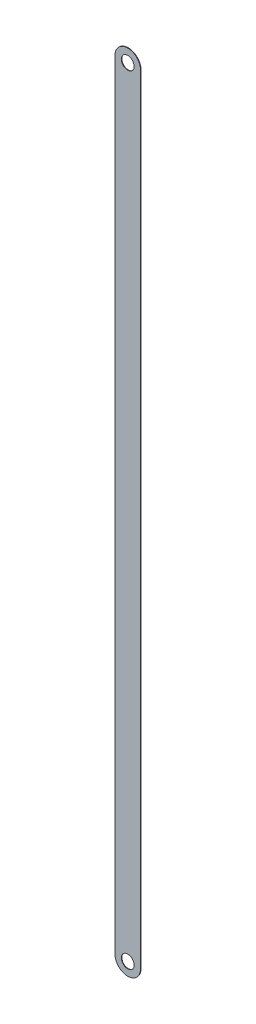
ISO-10303-21;
HEADER;
FILE_DESCRIPTION(('STEP AP214'),'2;1');
FILE_NAME('part.step','',(''),(''),'','','');
FILE_SCHEMA(('AUTOMOTIVE_DESIGN { 1 0 10303 214 1 1 1 1 }'));
ENDSEC;
DATA;
#1=APPLICATION_CONTEXT('core data for automotive mechanical design processes');
#2=APPLICATION_PROTOCOL_DEFINITION('international standard','automotive_design',2000,#1);
#3=PRODUCT_CONTEXT('',#1,'mechanical');
#4=PRODUCT('Part','Part','',(#3));
#5=PRODUCT_RELATED_PRODUCT_CATEGORY('part','',(#4));
#6=PRODUCT_DEFINITION_FORMATION('','',#4);
#7=PRODUCT_DEFINITION_CONTEXT('part definition',#1,'design');
#8=PRODUCT_DEFINITION('design','',#6,#7);
#9=PRODUCT_DEFINITION_SHAPE('','',#8);
#10=(LENGTH_UNIT() NAMED_UNIT(*) SI_UNIT(.MILLI.,.METRE.));
#11=(NAMED_UNIT(*) PLANE_ANGLE_UNIT() SI_UNIT($,.RADIAN.));
#12=(NAMED_UNIT(*) SI_UNIT($,.STERADIAN.) SOLID_ANGLE_UNIT());
#13=UNCERTAINTY_MEASURE_WITH_UNIT(LENGTH_MEASURE(1.E-05),#10,'distance_accuracy_value','');
#14=(GEOMETRIC_REPRESENTATION_CONTEXT(3) GLOBAL_UNCERTAINTY_ASSIGNED_CONTEXT((#13)) GLOBAL_UNIT_ASSIGNED_CONTEXT((#10,
#11,#12)) REPRESENTATION_CONTEXT('',''));
#15=CARTESIAN_POINT('',(0.,0.,0.));
#16=DIRECTION('',(0.,0.,1.));
#17=DIRECTION('',(1.,0.,0.));
#18=AXIS2_PLACEMENT_3D('',#15,#16,#17);
#19=CARTESIAN_POINT('',(0.,386.08,0.254));
#20=DIRECTION('',(0.,0.,1.));
#21=DIRECTION('',(1.,0.,0.));
#22=AXIS2_PLACEMENT_3D('',#19,#20,#21);
#23=PLANE('',#22);
#24=CARTESIAN_POINT('',(0.,386.08,0.254));
#25=DIRECTION('',(0.,0.,1.));
#26=DIRECTION('',(1.,0.,0.));
#27=AXIS2_PLACEMENT_3D('',#24,#25,#26);
#28=CIRCLE('',#27,3.17499999999999);
#29=CARTESIAN_POINT('',(3.175,386.08,0.254));
#30=VERTEX_POINT('',#29);
#31=EDGE_CURVE('E100',#30,#30,#28,.T.);
#32=ORIENTED_EDGE('',*,*,#31,.F.);
#33=EDGE_LOOP('',(#32));
#34=FACE_BOUND('',#33,.T.);
#35=CARTESIAN_POINT('',(0.,386.08,0.254));
#36=DIRECTION('',(0.,0.,1.));
#37=DIRECTION('',(1.,0.,0.));
#38=AXIS2_PLACEMENT_3D('',#35,#36,#37);
#39=CIRCLE('',#38,6.35);
#40=CARTESIAN_POINT('',(6.35000000000001,386.08,0.254));
#41=VERTEX_POINT('',#40);
#42=CARTESIAN_POINT('',(-6.34999999999999,386.08,0.254));
#43=VERTEX_POINT('',#42);
#44=EDGE_CURVE('E85',#41,#43,#39,.T.);
#45=ORIENTED_EDGE('',*,*,#44,.T.);
#46=DIRECTION('',(0.,-1.,0.));
#47=VECTOR('',#46,1.);
#48=CARTESIAN_POINT('',(-6.34999999999999,386.08,0.254));
#49=LINE('',#48,#47);
#50=CARTESIAN_POINT('',(-6.35,0.,0.254));
#51=VERTEX_POINT('',#50);
#52=EDGE_CURVE('E80',#43,#51,#49,.T.);
#53=ORIENTED_EDGE('',*,*,#52,.T.);
#54=CARTESIAN_POINT('',(0.,0.,0.254));
#55=DIRECTION('',(0.,0.,1.));
#56=DIRECTION('',(1.,0.,0.));
#57=AXIS2_PLACEMENT_3D('',#54,#55,#56);
#58=CIRCLE('',#57,6.35);
#59=CARTESIAN_POINT('',(6.35,0.,0.254));
#60=VERTEX_POINT('',#59);
#61=EDGE_CURVE('E83',#51,#60,#58,.T.);
#62=ORIENTED_EDGE('',*,*,#61,.T.);
#63=DIRECTION('',(0.,1.,0.));
#64=VECTOR('',#63,1.);
#65=CARTESIAN_POINT('',(6.35000000000001,386.08,0.254));
#66=LINE('',#65,#64);
#67=EDGE_CURVE('E50',#60,#41,#66,.T.);
#68=ORIENTED_EDGE('',*,*,#67,.T.);
#69=EDGE_LOOP('',(#45,#53,#62,#68));
#70=FACE_BOUND('',#69,.T.);
#71=CARTESIAN_POINT('',(0.,0.,0.254));
#72=DIRECTION('',(0.,0.,1.));
#73=DIRECTION('',(1.,0.,0.));
#74=AXIS2_PLACEMENT_3D('',#71,#72,#73);
#75=CIRCLE('',#74,3.175);
#76=CARTESIAN_POINT('',(3.175,0.,0.254));
#77=VERTEX_POINT('',#76);
#78=EDGE_CURVE('E115',#77,#77,#75,.T.);
#79=ORIENTED_EDGE('',*,*,#78,.F.);
#80=EDGE_LOOP('',(#79));
#81=FACE_BOUND('',#80,.T.);
#82=ADVANCED_FACE('F33',(#34,#70,#81),#23,.T.);
#83=CARTESIAN_POINT('',(0.,386.08,0.));
#84=DIRECTION('',(0.,0.,1.));
#85=DIRECTION('',(1.,0.,0.));
#86=AXIS2_PLACEMENT_3D('',#83,#84,#85);
#87=PLANE('',#86);
#88=CARTESIAN_POINT('',(0.,386.08,0.));
#89=DIRECTION('',(0.,0.,1.));
#90=DIRECTION('',(1.,0.,0.));
#91=AXIS2_PLACEMENT_3D('',#88,#89,#90);
#92=CIRCLE('',#91,6.35);
#93=CARTESIAN_POINT('',(6.35000000000001,386.08,0.));
#94=VERTEX_POINT('',#93);
#95=CARTESIAN_POINT('',(-6.34999999999999,386.08,0.));
#96=VERTEX_POINT('',#95);
#97=EDGE_CURVE('E97',#94,#96,#92,.T.);
#98=ORIENTED_EDGE('',*,*,#97,.F.);
#99=DIRECTION('',(0.,1.,0.));
#100=VECTOR('',#99,1.);
#101=CARTESIAN_POINT('',(6.35000000000001,386.08,0.));
#102=LINE('',#101,#100);
#103=CARTESIAN_POINT('',(6.35,0.,0.));
#104=VERTEX_POINT('',#103);
#105=EDGE_CURVE('E73',#104,#94,#102,.T.);
#106=ORIENTED_EDGE('',*,*,#105,.F.);
#107=CARTESIAN_POINT('',(0.,0.,0.));
#108=DIRECTION('',(0.,0.,1.));
#109=DIRECTION('',(1.,0.,0.));
#110=AXIS2_PLACEMENT_3D('',#107,#108,#109);
#111=CIRCLE('',#110,6.35);
#112=CARTESIAN_POINT('',(-6.35,0.,0.));
#113=VERTEX_POINT('',#112);
#114=EDGE_CURVE('E67',#113,#104,#111,.T.);
#115=ORIENTED_EDGE('',*,*,#114,.F.);
#116=DIRECTION('',(0.,-1.,0.));
#117=VECTOR('',#116,1.);
#118=CARTESIAN_POINT('',(-6.34999999999999,386.08,0.));
#119=LINE('',#118,#117);
#120=EDGE_CURVE('E89',#96,#113,#119,.T.);
#121=ORIENTED_EDGE('',*,*,#120,.F.);
#122=EDGE_LOOP('',(#98,#106,#115,#121));
#123=FACE_BOUND('',#122,.T.);
#124=CARTESIAN_POINT('',(0.,386.08,0.));
#125=DIRECTION('',(0.,0.,1.));
#126=DIRECTION('',(1.,0.,0.));
#127=AXIS2_PLACEMENT_3D('',#124,#125,#126);
#128=CIRCLE('',#127,3.17499999999999);
#129=CARTESIAN_POINT('',(3.175,386.08,0.));
#130=VERTEX_POINT('',#129);
#131=EDGE_CURVE('E112',#130,#130,#128,.T.);
#132=ORIENTED_EDGE('',*,*,#131,.T.);
#133=EDGE_LOOP('',(#132));
#134=FACE_BOUND('',#133,.T.);
#135=CARTESIAN_POINT('',(0.,0.,0.));
#136=DIRECTION('',(0.,0.,1.));
#137=DIRECTION('',(1.,0.,0.));
#138=AXIS2_PLACEMENT_3D('',#135,#136,#137);
#139=CIRCLE('',#138,3.175);
#140=CARTESIAN_POINT('',(3.175,0.,0.));
#141=VERTEX_POINT('',#140);
#142=EDGE_CURVE('E118',#141,#141,#139,.T.);
#143=ORIENTED_EDGE('',*,*,#142,.T.);
#144=EDGE_LOOP('',(#143));
#145=FACE_BOUND('',#144,.T.);
#146=ADVANCED_FACE('F108',(#123,#134,#145),#87,.F.);
#147=CARTESIAN_POINT('',(0.,386.08,0.254));
#148=DIRECTION('',(0.,0.,-1.));
#149=DIRECTION('',(-1.,0.,0.));
#150=AXIS2_PLACEMENT_3D('',#147,#148,#149);
#151=CYLINDRICAL_SURFACE('',#150,6.35);
#152=ORIENTED_EDGE('',*,*,#97,.T.);
#153=DIRECTION('',(0.,0.,-1.));
#154=VECTOR('',#153,1.);
#155=CARTESIAN_POINT('',(-6.34999999999999,386.08,0.254));
#156=LINE('',#155,#154);
#157=EDGE_CURVE('E11',#43,#96,#156,.T.);
#158=ORIENTED_EDGE('',*,*,#157,.F.);
#159=ORIENTED_EDGE('',*,*,#44,.F.);
#160=DIRECTION('',(0.,0.,-1.));
#161=VECTOR('',#160,1.);
#162=CARTESIAN_POINT('',(6.35000000000001,386.08,0.254));
#163=LINE('',#162,#161);
#164=EDGE_CURVE('E93',#41,#94,#163,.T.);
#165=ORIENTED_EDGE('',*,*,#164,.T.);
#166=EDGE_LOOP('',(#152,#158,#159,#165));
#167=FACE_BOUND('',#166,.T.);
#168=ADVANCED_FACE('F35',(#167),#151,.T.);
#169=CARTESIAN_POINT('',(-6.34999999999999,386.08,0.254));
#170=DIRECTION('',(1.,0.,0.));
#171=DIRECTION('',(0.,1.,0.));
#172=AXIS2_PLACEMENT_3D('',#169,#170,#171);
#173=PLANE('',#172);
#174=ORIENTED_EDGE('',*,*,#120,.T.);
#175=DIRECTION('',(0.,0.,-1.));
#176=VECTOR('',#175,1.);
#177=CARTESIAN_POINT('',(-6.35,0.,0.254));
#178=LINE('',#177,#176);
#179=EDGE_CURVE('E42',#51,#113,#178,.T.);
#180=ORIENTED_EDGE('',*,*,#179,.F.);
#181=ORIENTED_EDGE('',*,*,#52,.F.);
#182=ORIENTED_EDGE('',*,*,#157,.T.);
#183=EDGE_LOOP('',(#174,#180,#181,#182));
#184=FACE_BOUND('',#183,.T.);
#185=ADVANCED_FACE('F88',(#184),#173,.F.);
#186=CARTESIAN_POINT('',(0.,0.,0.254));
#187=DIRECTION('',(0.,0.,-1.));
#188=DIRECTION('',(-1.,0.,0.));
#189=AXIS2_PLACEMENT_3D('',#186,#187,#188);
#190=CYLINDRICAL_SURFACE('',#189,6.35);
#191=ORIENTED_EDGE('',*,*,#114,.T.);
#192=DIRECTION('',(0.,0.,-1.));
#193=VECTOR('',#192,1.);
#194=CARTESIAN_POINT('',(6.35,0.,0.254));
#195=LINE('',#194,#193);
#196=EDGE_CURVE('E90',#60,#104,#195,.T.);
#197=ORIENTED_EDGE('',*,*,#196,.F.);
#198=ORIENTED_EDGE('',*,*,#61,.F.);
#199=ORIENTED_EDGE('',*,*,#179,.T.);
#200=EDGE_LOOP('',(#191,#197,#198,#199));
#201=FACE_BOUND('',#200,.T.);
#202=ADVANCED_FACE('F91',(#201),#190,.T.);
#203=CARTESIAN_POINT('',(6.35000000000001,386.08,0.254));
#204=DIRECTION('',(-1.,0.,0.));
#205=DIRECTION('',(0.,-1.,0.));
#206=AXIS2_PLACEMENT_3D('',#203,#204,#205);
#207=PLANE('',#206);
#208=ORIENTED_EDGE('',*,*,#105,.T.);
#209=ORIENTED_EDGE('',*,*,#164,.F.);
#210=ORIENTED_EDGE('',*,*,#67,.F.);
#211=ORIENTED_EDGE('',*,*,#196,.T.);
#212=EDGE_LOOP('',(#208,#209,#210,#211));
#213=FACE_BOUND('',#212,.T.);
#214=ADVANCED_FACE('F105',(#213),#207,.F.);
#215=CARTESIAN_POINT('',(0.,386.08,0.254));
#216=DIRECTION('',(0.,0.,-1.));
#217=DIRECTION('',(-1.,0.,0.));
#218=AXIS2_PLACEMENT_3D('',#215,#216,#217);
#219=CYLINDRICAL_SURFACE('',#218,3.17499999999999);
#220=ORIENTED_EDGE('',*,*,#31,.T.);
#221=EDGE_LOOP('',(#220));
#222=FACE_BOUND('',#221,.T.);
#223=ORIENTED_EDGE('',*,*,#131,.F.);
#224=EDGE_LOOP('',(#223));
#225=FACE_BOUND('',#224,.T.);
#226=ADVANCED_FACE('F135',(#222,#225),#219,.F.);
#227=CARTESIAN_POINT('',(0.,0.,0.254));
#228=DIRECTION('',(0.,0.,-1.));
#229=DIRECTION('',(-1.,0.,0.));
#230=AXIS2_PLACEMENT_3D('',#227,#228,#229);
#231=CYLINDRICAL_SURFACE('',#230,3.175);
#232=ORIENTED_EDGE('',*,*,#78,.T.);
#233=EDGE_LOOP('',(#232));
#234=FACE_BOUND('',#233,.T.);
#235=ORIENTED_EDGE('',*,*,#142,.F.);
#236=EDGE_LOOP('',(#235));
#237=FACE_BOUND('',#236,.T.);
#238=ADVANCED_FACE('F124',(#234,#237),#231,.F.);
#239=CLOSED_SHELL('',(#82,#146,#168,#185,#202,#214,#226,#238));
#240=MANIFOLD_SOLID_BREP('B2',#239);
#241=ADVANCED_BREP_SHAPE_REPRESENTATION('',(#18,#240),#14);
#242=SHAPE_DEFINITION_REPRESENTATION(#9,#241);
ENDSEC;
END-ISO-10303-21;
